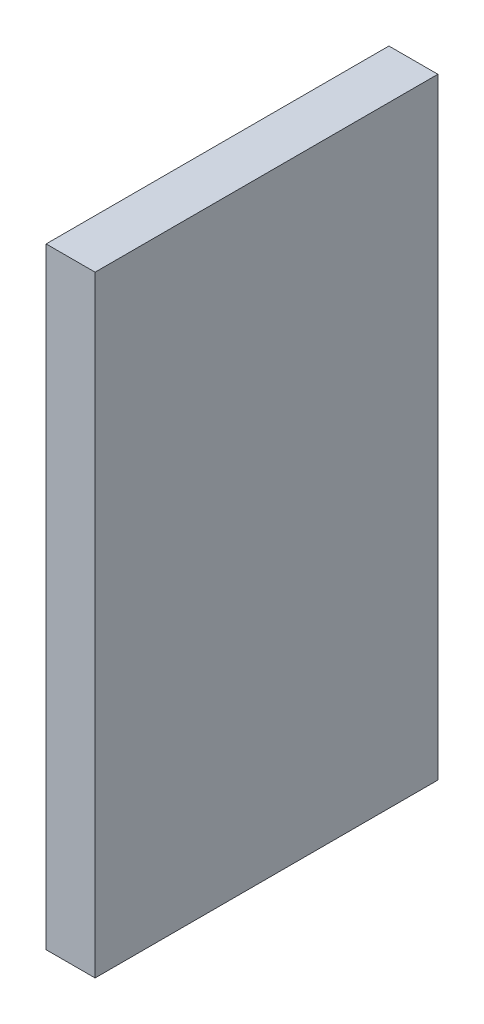
ISO-10303-21;
HEADER;
FILE_DESCRIPTION(('STEP AP214'),'2;1');
FILE_NAME('part.step','',(''),(''),'','','');
FILE_SCHEMA(('AUTOMOTIVE_DESIGN { 1 0 10303 214 1 1 1 1 }'));
ENDSEC;
DATA;
#1=APPLICATION_CONTEXT('core data for automotive mechanical design processes');
#2=APPLICATION_PROTOCOL_DEFINITION('international standard','automotive_design',2000,#1);
#3=PRODUCT_CONTEXT('',#1,'mechanical');
#4=PRODUCT('Part','Part','',(#3));
#5=PRODUCT_RELATED_PRODUCT_CATEGORY('part','',(#4));
#6=PRODUCT_DEFINITION_FORMATION('','',#4);
#7=PRODUCT_DEFINITION_CONTEXT('part definition',#1,'design');
#8=PRODUCT_DEFINITION('design','',#6,#7);
#9=PRODUCT_DEFINITION_SHAPE('','',#8);
#10=(LENGTH_UNIT() NAMED_UNIT(*) SI_UNIT(.MILLI.,.METRE.));
#11=(NAMED_UNIT(*) PLANE_ANGLE_UNIT() SI_UNIT($,.RADIAN.));
#12=(NAMED_UNIT(*) SI_UNIT($,.STERADIAN.) SOLID_ANGLE_UNIT());
#13=UNCERTAINTY_MEASURE_WITH_UNIT(LENGTH_MEASURE(1.E-05),#10,'distance_accuracy_value','');
#14=(GEOMETRIC_REPRESENTATION_CONTEXT(3) GLOBAL_UNCERTAINTY_ASSIGNED_CONTEXT((#13)) GLOBAL_UNIT_ASSIGNED_CONTEXT((#10,
#11,#12)) REPRESENTATION_CONTEXT('',''));
#15=CARTESIAN_POINT('',(0.,0.,0.));
#16=DIRECTION('',(0.,0.,1.));
#17=DIRECTION('',(1.,0.,0.));
#18=AXIS2_PLACEMENT_3D('',#15,#16,#17);
#19=CARTESIAN_POINT('',(19.3621142761091,286.757590165204,758.873884040744));
#20=DIRECTION('',(0.,0.,-1.));
#21=DIRECTION('',(-1.,0.,0.));
#22=AXIS2_PLACEMENT_3D('',#19,#20,#21);
#23=PLANE('',#22);
#24=DIRECTION('',(0.,-1.,0.));
#25=VECTOR('',#24,1.);
#26=CARTESIAN_POINT('',(14.3621142761091,286.757590165204,758.873884040744));
#27=LINE('',#26,#25);
#28=CARTESIAN_POINT('',(14.3621142761091,286.757590165204,758.873884040744));
#29=VERTEX_POINT('',#28);
#30=CARTESIAN_POINT('',(14.3621142761087,224.317578978395,758.873884040744));
#31=VERTEX_POINT('',#30);
#32=EDGE_CURVE('E102',#29,#31,#27,.T.);
#33=ORIENTED_EDGE('',*,*,#32,.T.);
#34=DIRECTION('',(-1.,0.,0.));
#35=VECTOR('',#34,1.);
#36=CARTESIAN_POINT('',(19.3621142761087,224.317578978395,758.873884040744));
#37=LINE('',#36,#35);
#38=CARTESIAN_POINT('',(19.3621142761087,224.317578978395,758.873884040744));
#39=VERTEX_POINT('',#38);
#40=EDGE_CURVE('E11',#39,#31,#37,.T.);
#41=ORIENTED_EDGE('',*,*,#40,.F.);
#42=DIRECTION('',(0.,-1.,0.));
#43=VECTOR('',#42,1.);
#44=CARTESIAN_POINT('',(19.3621142761091,286.757590165204,758.873884040744));
#45=LINE('',#44,#43);
#46=CARTESIAN_POINT('',(19.3621142761091,286.757590165204,758.873884040744));
#47=VERTEX_POINT('',#46);
#48=EDGE_CURVE('E90',#47,#39,#45,.T.);
#49=ORIENTED_EDGE('',*,*,#48,.F.);
#50=DIRECTION('',(-1.,0.,0.));
#51=VECTOR('',#50,1.);
#52=CARTESIAN_POINT('',(19.3621142761091,286.757590165204,758.873884040744));
#53=LINE('',#52,#51);
#54=EDGE_CURVE('E98',#47,#29,#53,.T.);
#55=ORIENTED_EDGE('',*,*,#54,.T.);
#56=EDGE_LOOP('',(#33,#41,#49,#55));
#57=FACE_BOUND('',#56,.T.);
#58=ADVANCED_FACE('F39',(#57),#23,.F.);
#59=CARTESIAN_POINT('',(19.3621142761087,224.317578978395,758.873884040744));
#60=DIRECTION('',(0.,1.,0.));
#61=DIRECTION('',(-1.,0.,0.));
#62=AXIS2_PLACEMENT_3D('',#59,#60,#61);
#63=PLANE('',#62);
#64=DIRECTION('',(0.,0.,-1.));
#65=VECTOR('',#64,1.);
#66=CARTESIAN_POINT('',(14.3621142761087,224.317578978395,758.873884040744));
#67=LINE('',#66,#65);
#68=CARTESIAN_POINT('',(14.3621142761088,224.317578978395,723.858505218338));
#69=VERTEX_POINT('',#68);
#70=EDGE_CURVE('E94',#31,#69,#67,.T.);
#71=ORIENTED_EDGE('',*,*,#70,.T.);
#72=DIRECTION('',(-1.,0.,0.));
#73=VECTOR('',#72,1.);
#74=CARTESIAN_POINT('',(19.3621142761088,224.317578978395,723.858505218338));
#75=LINE('',#74,#73);
#76=CARTESIAN_POINT('',(19.3621142761088,224.317578978395,723.858505218338));
#77=VERTEX_POINT('',#76);
#78=EDGE_CURVE('E47',#77,#69,#75,.T.);
#79=ORIENTED_EDGE('',*,*,#78,.F.);
#80=DIRECTION('',(0.,0.,-1.));
#81=VECTOR('',#80,1.);
#82=CARTESIAN_POINT('',(19.3621142761087,224.317578978395,758.873884040744));
#83=LINE('',#82,#81);
#84=EDGE_CURVE('E85',#39,#77,#83,.T.);
#85=ORIENTED_EDGE('',*,*,#84,.F.);
#86=ORIENTED_EDGE('',*,*,#40,.T.);
#87=EDGE_LOOP('',(#71,#79,#85,#86));
#88=FACE_BOUND('',#87,.T.);
#89=ADVANCED_FACE('F93',(#88),#63,.F.);
#90=CARTESIAN_POINT('',(19.3621142761093,286.757590165204,723.858505218338));
#91=DIRECTION('',(0.,0.,1.));
#92=DIRECTION('',(1.,0.,0.));
#93=AXIS2_PLACEMENT_3D('',#90,#91,#92);
#94=PLANE('',#93);
#95=DIRECTION('',(0.,1.,0.));
#96=VECTOR('',#95,1.);
#97=CARTESIAN_POINT('',(14.3621142761093,286.757590165204,723.858505218338));
#98=LINE('',#97,#96);
#99=CARTESIAN_POINT('',(14.3621142761093,286.757590165204,723.858505218338));
#100=VERTEX_POINT('',#99);
#101=EDGE_CURVE('E72',#69,#100,#98,.T.);
#102=ORIENTED_EDGE('',*,*,#101,.T.);
#103=DIRECTION('',(-1.,0.,0.));
#104=VECTOR('',#103,1.);
#105=CARTESIAN_POINT('',(19.3621142761093,286.757590165204,723.858505218338));
#106=LINE('',#105,#104);
#107=CARTESIAN_POINT('',(19.3621142761093,286.757590165204,723.858505218338));
#108=VERTEX_POINT('',#107);
#109=EDGE_CURVE('E95',#108,#100,#106,.T.);
#110=ORIENTED_EDGE('',*,*,#109,.F.);
#111=DIRECTION('',(0.,1.,0.));
#112=VECTOR('',#111,1.);
#113=CARTESIAN_POINT('',(19.3621142761093,286.757590165204,723.858505218338));
#114=LINE('',#113,#112);
#115=EDGE_CURVE('E88',#77,#108,#114,.T.);
#116=ORIENTED_EDGE('',*,*,#115,.F.);
#117=ORIENTED_EDGE('',*,*,#78,.T.);
#118=EDGE_LOOP('',(#102,#110,#116,#117));
#119=FACE_BOUND('',#118,.T.);
#120=ADVANCED_FACE('F96',(#119),#94,.F.);
#121=CARTESIAN_POINT('',(19.3621142761091,286.757590165204,758.873884040744));
#122=DIRECTION('',(0.,-1.,0.));
#123=DIRECTION('',(1.,0.,0.));
#124=AXIS2_PLACEMENT_3D('',#121,#122,#123);
#125=PLANE('',#124);
#126=DIRECTION('',(0.,0.,1.));
#127=VECTOR('',#126,1.);
#128=CARTESIAN_POINT('',(14.3621142761091,286.757590165204,758.873884040744));
#129=LINE('',#128,#127);
#130=EDGE_CURVE('E78',#100,#29,#129,.T.);
#131=ORIENTED_EDGE('',*,*,#130,.T.);
#132=ORIENTED_EDGE('',*,*,#54,.F.);
#133=DIRECTION('',(0.,0.,1.));
#134=VECTOR('',#133,1.);
#135=CARTESIAN_POINT('',(19.3621142761091,286.757590165204,758.873884040744));
#136=LINE('',#135,#134);
#137=EDGE_CURVE('E55',#108,#47,#136,.T.);
#138=ORIENTED_EDGE('',*,*,#137,.F.);
#139=ORIENTED_EDGE('',*,*,#109,.T.);
#140=EDGE_LOOP('',(#131,#132,#138,#139));
#141=FACE_BOUND('',#140,.T.);
#142=ADVANCED_FACE('F109',(#141),#125,.F.);
#143=CARTESIAN_POINT('',(19.3621142761101,-1.43623323100023E-13,0.));
#144=DIRECTION('',(1.,0.,0.));
#145=DIRECTION('',(0.,1.,0.));
#146=AXIS2_PLACEMENT_3D('',#143,#144,#145);
#147=PLANE('',#146);
#148=ORIENTED_EDGE('',*,*,#48,.T.);
#149=ORIENTED_EDGE('',*,*,#84,.T.);
#150=ORIENTED_EDGE('',*,*,#115,.T.);
#151=ORIENTED_EDGE('',*,*,#137,.T.);
#152=EDGE_LOOP('',(#148,#149,#150,#151));
#153=FACE_BOUND('',#152,.T.);
#154=ADVANCED_FACE('F86',(#153),#147,.T.);
#155=CARTESIAN_POINT('',(14.3621142761101,-1.06536131544657E-13,0.));
#156=DIRECTION('',(1.,0.,0.));
#157=DIRECTION('',(0.,1.,0.));
#158=AXIS2_PLACEMENT_3D('',#155,#156,#157);
#159=PLANE('',#158);
#160=ORIENTED_EDGE('',*,*,#32,.F.);
#161=ORIENTED_EDGE('',*,*,#130,.F.);
#162=ORIENTED_EDGE('',*,*,#101,.F.);
#163=ORIENTED_EDGE('',*,*,#70,.F.);
#164=EDGE_LOOP('',(#160,#161,#162,#163));
#165=FACE_BOUND('',#164,.T.);
#166=ADVANCED_FACE('F112',(#165),#159,.F.);
#167=CLOSED_SHELL('',(#58,#89,#120,#142,#154,#166));
#168=MANIFOLD_SOLID_BREP('B2',#167);
#169=ADVANCED_BREP_SHAPE_REPRESENTATION('',(#18,#168),#14);
#170=SHAPE_DEFINITION_REPRESENTATION(#9,#169);
ENDSEC;
END-ISO-10303-21;
